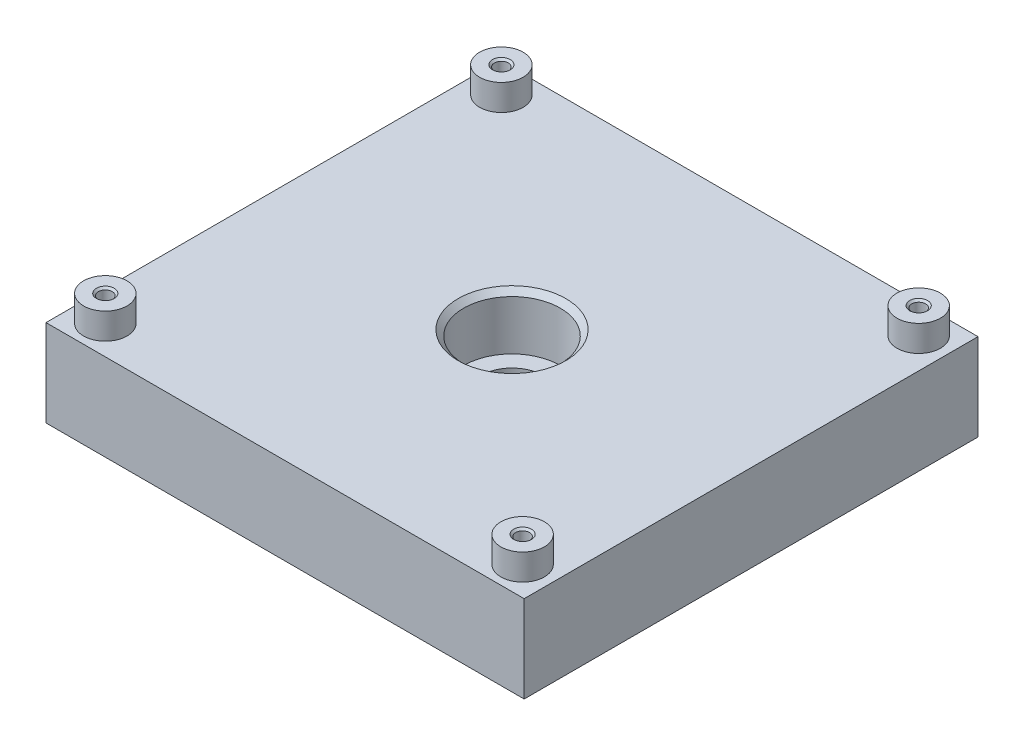
ISO-10303-21;
HEADER;
FILE_DESCRIPTION(('STEP AP214'),'2;1');
FILE_NAME('part.step','',(''),(''),'','','');
FILE_SCHEMA(('AUTOMOTIVE_DESIGN { 1 0 10303 214 1 1 1 1 }'));
ENDSEC;
DATA;
#1=APPLICATION_CONTEXT('core data for automotive mechanical design processes');
#2=APPLICATION_PROTOCOL_DEFINITION('international standard','automotive_design',2000,#1);
#3=PRODUCT_CONTEXT('',#1,'mechanical');
#4=PRODUCT('Part','Part','',(#3));
#5=PRODUCT_RELATED_PRODUCT_CATEGORY('part','',(#4));
#6=PRODUCT_DEFINITION_FORMATION('','',#4);
#7=PRODUCT_DEFINITION_CONTEXT('part definition',#1,'design');
#8=PRODUCT_DEFINITION('design','',#6,#7);
#9=PRODUCT_DEFINITION_SHAPE('','',#8);
#10=(LENGTH_UNIT() NAMED_UNIT(*) SI_UNIT(.MILLI.,.METRE.));
#11=(NAMED_UNIT(*) PLANE_ANGLE_UNIT() SI_UNIT($,.RADIAN.));
#12=(NAMED_UNIT(*) SI_UNIT($,.STERADIAN.) SOLID_ANGLE_UNIT());
#13=UNCERTAINTY_MEASURE_WITH_UNIT(LENGTH_MEASURE(1.E-05),#10,'distance_accuracy_value','');
#14=(GEOMETRIC_REPRESENTATION_CONTEXT(3) GLOBAL_UNCERTAINTY_ASSIGNED_CONTEXT((#13)) GLOBAL_UNIT_ASSIGNED_CONTEXT((#10,
#11,#12)) REPRESENTATION_CONTEXT('',''));
#15=CARTESIAN_POINT('',(0.,0.,0.));
#16=DIRECTION('',(0.,0.,1.));
#17=DIRECTION('',(1.,0.,0.));
#18=AXIS2_PLACEMENT_3D('',#15,#16,#17);
#19=CARTESIAN_POINT('',(27.5,10.,-26.1));
#20=DIRECTION('',(-1.,0.,0.));
#21=DIRECTION('',(0.,0.,1.));
#22=AXIS2_PLACEMENT_3D('',#19,#20,#21);
#23=PLANE('',#22);
#24=DIRECTION('',(0.,0.,-1.));
#25=VECTOR('',#24,1.);
#26=CARTESIAN_POINT('',(27.5,0.,-26.1));
#27=LINE('',#26,#25);
#28=CARTESIAN_POINT('',(27.5,0.,26.1));
#29=VERTEX_POINT('',#28);
#30=CARTESIAN_POINT('',(27.5,0.,-26.1));
#31=VERTEX_POINT('',#30);
#32=EDGE_CURVE('E111',#29,#31,#27,.T.);
#33=ORIENTED_EDGE('',*,*,#32,.T.);
#34=DIRECTION('',(0.,-1.,0.));
#35=VECTOR('',#34,1.);
#36=CARTESIAN_POINT('',(27.5,10.,-26.1));
#37=LINE('',#36,#35);
#38=CARTESIAN_POINT('',(27.5,10.,-26.1));
#39=VERTEX_POINT('',#38);
#40=EDGE_CURVE('E11',#39,#31,#37,.T.);
#41=ORIENTED_EDGE('',*,*,#40,.F.);
#42=DIRECTION('',(0.,0.,-1.));
#43=VECTOR('',#42,1.);
#44=CARTESIAN_POINT('',(27.5,10.,-26.1));
#45=LINE('',#44,#43);
#46=CARTESIAN_POINT('',(27.5,10.,26.1));
#47=VERTEX_POINT('',#46);
#48=EDGE_CURVE('E95',#47,#39,#45,.T.);
#49=ORIENTED_EDGE('',*,*,#48,.F.);
#50=DIRECTION('',(0.,-1.,0.));
#51=VECTOR('',#50,1.);
#52=CARTESIAN_POINT('',(27.5,10.,26.1));
#53=LINE('',#52,#51);
#54=EDGE_CURVE('E107',#47,#29,#53,.T.);
#55=ORIENTED_EDGE('',*,*,#54,.T.);
#56=EDGE_LOOP('',(#33,#41,#49,#55));
#57=FACE_BOUND('',#56,.T.);
#58=ADVANCED_FACE('F43',(#57),#23,.F.);
#59=CARTESIAN_POINT('',(-27.5,10.,-26.1));
#60=DIRECTION('',(0.,0.,1.));
#61=DIRECTION('',(1.,0.,0.));
#62=AXIS2_PLACEMENT_3D('',#59,#60,#61);
#63=PLANE('',#62);
#64=DIRECTION('',(-1.,0.,0.));
#65=VECTOR('',#64,1.);
#66=CARTESIAN_POINT('',(-27.5,0.,-26.1));
#67=LINE('',#66,#65);
#68=CARTESIAN_POINT('',(-27.5,0.,-26.1));
#69=VERTEX_POINT('',#68);
#70=EDGE_CURVE('E100',#31,#69,#67,.T.);
#71=ORIENTED_EDGE('',*,*,#70,.T.);
#72=DIRECTION('',(0.,-1.,0.));
#73=VECTOR('',#72,1.);
#74=CARTESIAN_POINT('',(-27.5,10.,-26.1));
#75=LINE('',#74,#73);
#76=CARTESIAN_POINT('',(-27.5,10.,-26.1));
#77=VERTEX_POINT('',#76);
#78=EDGE_CURVE('E52',#77,#69,#75,.T.);
#79=ORIENTED_EDGE('',*,*,#78,.F.);
#80=DIRECTION('',(-1.,0.,0.));
#81=VECTOR('',#80,1.);
#82=CARTESIAN_POINT('',(-27.5,10.,-26.1));
#83=LINE('',#82,#81);
#84=EDGE_CURVE('E90',#39,#77,#83,.T.);
#85=ORIENTED_EDGE('',*,*,#84,.F.);
#86=ORIENTED_EDGE('',*,*,#40,.T.);
#87=EDGE_LOOP('',(#71,#79,#85,#86));
#88=FACE_BOUND('',#87,.T.);
#89=ADVANCED_FACE('F99',(#88),#63,.F.);
#90=CARTESIAN_POINT('',(-27.5,10.,-26.1));
#91=DIRECTION('',(1.,0.,0.));
#92=DIRECTION('',(0.,0.,-1.));
#93=AXIS2_PLACEMENT_3D('',#90,#91,#92);
#94=PLANE('',#93);
#95=DIRECTION('',(0.,0.,1.));
#96=VECTOR('',#95,1.);
#97=CARTESIAN_POINT('',(-27.5,0.,-26.1));
#98=LINE('',#97,#96);
#99=CARTESIAN_POINT('',(-27.5,0.,26.1));
#100=VERTEX_POINT('',#99);
#101=EDGE_CURVE('E77',#69,#100,#98,.T.);
#102=ORIENTED_EDGE('',*,*,#101,.T.);
#103=DIRECTION('',(0.,-1.,0.));
#104=VECTOR('',#103,1.);
#105=CARTESIAN_POINT('',(-27.5,10.,26.1));
#106=LINE('',#105,#104);
#107=CARTESIAN_POINT('',(-27.5,10.,26.1));
#108=VERTEX_POINT('',#107);
#109=EDGE_CURVE('E102',#108,#100,#106,.T.);
#110=ORIENTED_EDGE('',*,*,#109,.F.);
#111=DIRECTION('',(0.,0.,1.));
#112=VECTOR('',#111,1.);
#113=CARTESIAN_POINT('',(-27.5,10.,-26.1));
#114=LINE('',#113,#112);
#115=EDGE_CURVE('E93',#77,#108,#114,.T.);
#116=ORIENTED_EDGE('',*,*,#115,.F.);
#117=ORIENTED_EDGE('',*,*,#78,.T.);
#118=EDGE_LOOP('',(#102,#110,#116,#117));
#119=FACE_BOUND('',#118,.T.);
#120=ADVANCED_FACE('F103',(#119),#94,.F.);
#121=CARTESIAN_POINT('',(-27.5,10.,26.1));
#122=DIRECTION('',(0.,0.,-1.));
#123=DIRECTION('',(-1.,0.,0.));
#124=AXIS2_PLACEMENT_3D('',#121,#122,#123);
#125=PLANE('',#124);
#126=DIRECTION('',(1.,0.,0.));
#127=VECTOR('',#126,1.);
#128=CARTESIAN_POINT('',(-27.5,0.,26.1));
#129=LINE('',#128,#127);
#130=EDGE_CURVE('E83',#100,#29,#129,.T.);
#131=ORIENTED_EDGE('',*,*,#130,.T.);
#132=ORIENTED_EDGE('',*,*,#54,.F.);
#133=DIRECTION('',(1.,0.,0.));
#134=VECTOR('',#133,1.);
#135=CARTESIAN_POINT('',(-27.5,10.,26.1));
#136=LINE('',#135,#134);
#137=EDGE_CURVE('E60',#108,#47,#136,.T.);
#138=ORIENTED_EDGE('',*,*,#137,.F.);
#139=ORIENTED_EDGE('',*,*,#109,.T.);
#140=EDGE_LOOP('',(#131,#132,#138,#139));
#141=FACE_BOUND('',#140,.T.);
#142=ADVANCED_FACE('F125',(#141),#125,.F.);
#143=CARTESIAN_POINT('',(0.,10.,0.));
#144=DIRECTION('',(0.,1.,0.));
#145=DIRECTION('',(0.,0.,1.));
#146=AXIS2_PLACEMENT_3D('',#143,#144,#145);
#147=PLANE('',#146);
#148=CARTESIAN_POINT('',(24.,10.,22.7781818181818));
#149=DIRECTION('',(0.,1.,0.));
#150=DIRECTION('',(0.,0.,1.));
#151=AXIS2_PLACEMENT_3D('',#148,#149,#150);
#152=CIRCLE('',#151,2.5);
#153=CARTESIAN_POINT('',(24.,10.,25.2781818181818));
#154=VERTEX_POINT('',#153);
#155=EDGE_CURVE('E176',#154,#154,#152,.T.);
#156=ORIENTED_EDGE('',*,*,#155,.F.);
#157=EDGE_LOOP('',(#156));
#158=FACE_BOUND('',#157,.T.);
#159=CARTESIAN_POINT('',(-24.,10.,22.7781818181818));
#160=DIRECTION('',(0.,1.,0.));
#161=DIRECTION('',(0.,0.,1.));
#162=AXIS2_PLACEMENT_3D('',#159,#160,#161);
#163=CIRCLE('',#162,2.5);
#164=CARTESIAN_POINT('',(-24.,10.,25.2781818181818));
#165=VERTEX_POINT('',#164);
#166=EDGE_CURVE('E168',#165,#165,#163,.T.);
#167=ORIENTED_EDGE('',*,*,#166,.F.);
#168=EDGE_LOOP('',(#167));
#169=FACE_BOUND('',#168,.T.);
#170=CARTESIAN_POINT('',(24.,10.,-22.7781818181818));
#171=DIRECTION('',(0.,1.,0.));
#172=DIRECTION('',(0.,0.,1.));
#173=AXIS2_PLACEMENT_3D('',#170,#171,#172);
#174=CIRCLE('',#173,2.5);
#175=CARTESIAN_POINT('',(24.,10.,-20.2781818181818));
#176=VERTEX_POINT('',#175);
#177=EDGE_CURVE('E160',#176,#176,#174,.T.);
#178=ORIENTED_EDGE('',*,*,#177,.F.);
#179=EDGE_LOOP('',(#178));
#180=FACE_BOUND('',#179,.T.);
#181=CARTESIAN_POINT('',(-24.,10.,-22.7781818181818));
#182=DIRECTION('',(0.,1.,0.));
#183=DIRECTION('',(0.,0.,1.));
#184=AXIS2_PLACEMENT_3D('',#181,#182,#183);
#185=CIRCLE('',#184,2.5);
#186=CARTESIAN_POINT('',(-24.,10.,-20.2781818181818));
#187=VERTEX_POINT('',#186);
#188=EDGE_CURVE('E152',#187,#187,#185,.T.);
#189=ORIENTED_EDGE('',*,*,#188,.F.);
#190=EDGE_LOOP('',(#189));
#191=FACE_BOUND('',#190,.T.);
#192=CARTESIAN_POINT('',(0.,10.,0.));
#193=DIRECTION('',(0.,1.,0.));
#194=DIRECTION('',(0.,0.,1.));
#195=AXIS2_PLACEMENT_3D('',#192,#193,#194);
#196=CIRCLE('',#195,6.19125);
#197=CARTESIAN_POINT('',(0.,10.,6.19125));
#198=VERTEX_POINT('',#197);
#199=EDGE_CURVE('E147',#198,#198,#196,.T.);
#200=ORIENTED_EDGE('',*,*,#199,.F.);
#201=EDGE_LOOP('',(#200));
#202=FACE_BOUND('',#201,.T.);
#203=ORIENTED_EDGE('',*,*,#48,.T.);
#204=ORIENTED_EDGE('',*,*,#84,.T.);
#205=ORIENTED_EDGE('',*,*,#115,.T.);
#206=ORIENTED_EDGE('',*,*,#137,.T.);
#207=EDGE_LOOP('',(#203,#204,#205,#206));
#208=FACE_BOUND('',#207,.T.);
#209=ADVANCED_FACE('F91',(#158,#169,#180,#191,#202,#208),#147,.T.);
#210=CARTESIAN_POINT('',(0.,0.,0.));
#211=DIRECTION('',(0.,1.,0.));
#212=DIRECTION('',(0.,0.,1.));
#213=AXIS2_PLACEMENT_3D('',#210,#211,#212);
#214=PLANE('',#213);
#215=CARTESIAN_POINT('',(-24.,0.,-22.7781818181818));
#216=DIRECTION('',(0.,1.,0.));
#217=DIRECTION('',(0.,0.,1.));
#218=AXIS2_PLACEMENT_3D('',#215,#216,#217);
#219=CIRCLE('',#218,0.799999999999999);
#220=CARTESIAN_POINT('',(-24.,0.,-21.9781818181818));
#221=VERTEX_POINT('',#220);
#222=EDGE_CURVE('E219',#221,#221,#219,.T.);
#223=ORIENTED_EDGE('',*,*,#222,.T.);
#224=EDGE_LOOP('',(#223));
#225=FACE_BOUND('',#224,.T.);
#226=CARTESIAN_POINT('',(24.,0.,-22.7781818181818));
#227=DIRECTION('',(0.,1.,0.));
#228=DIRECTION('',(0.,0.,1.));
#229=AXIS2_PLACEMENT_3D('',#226,#227,#228);
#230=CIRCLE('',#229,0.799999999999999);
#231=CARTESIAN_POINT('',(24.,0.,-21.9781818181818));
#232=VERTEX_POINT('',#231);
#233=EDGE_CURVE('E207',#232,#232,#230,.T.);
#234=ORIENTED_EDGE('',*,*,#233,.T.);
#235=EDGE_LOOP('',(#234));
#236=FACE_BOUND('',#235,.T.);
#237=CARTESIAN_POINT('',(-24.,0.,22.7781818181818));
#238=DIRECTION('',(0.,1.,0.));
#239=DIRECTION('',(0.,0.,1.));
#240=AXIS2_PLACEMENT_3D('',#237,#238,#239);
#241=CIRCLE('',#240,0.799999999999999);
#242=CARTESIAN_POINT('',(-24.,0.,23.5781818181818));
#243=VERTEX_POINT('',#242);
#244=EDGE_CURVE('E195',#243,#243,#241,.T.);
#245=ORIENTED_EDGE('',*,*,#244,.T.);
#246=EDGE_LOOP('',(#245));
#247=FACE_BOUND('',#246,.T.);
#248=CARTESIAN_POINT('',(24.,0.,22.7781818181818));
#249=DIRECTION('',(0.,1.,0.));
#250=DIRECTION('',(0.,0.,1.));
#251=AXIS2_PLACEMENT_3D('',#248,#249,#250);
#252=CIRCLE('',#251,0.799999999999999);
#253=CARTESIAN_POINT('',(24.,0.,23.5781818181818));
#254=VERTEX_POINT('',#253);
#255=EDGE_CURVE('E180',#254,#254,#252,.T.);
#256=ORIENTED_EDGE('',*,*,#255,.T.);
#257=EDGE_LOOP('',(#256));
#258=FACE_BOUND('',#257,.T.);
#259=CARTESIAN_POINT('',(0.,0.,0.));
#260=DIRECTION('',(0.,1.,0.));
#261=DIRECTION('',(0.,0.,1.));
#262=AXIS2_PLACEMENT_3D('',#259,#260,#261);
#263=CIRCLE('',#262,3.57124);
#264=CARTESIAN_POINT('',(0.,0.,3.57124));
#265=VERTEX_POINT('',#264);
#266=EDGE_CURVE('E115',#265,#265,#263,.T.);
#267=ORIENTED_EDGE('',*,*,#266,.T.);
#268=EDGE_LOOP('',(#267));
#269=FACE_BOUND('',#268,.T.);
#270=ORIENTED_EDGE('',*,*,#32,.F.);
#271=ORIENTED_EDGE('',*,*,#130,.F.);
#272=ORIENTED_EDGE('',*,*,#101,.F.);
#273=ORIENTED_EDGE('',*,*,#70,.F.);
#274=EDGE_LOOP('',(#270,#271,#272,#273));
#275=FACE_BOUND('',#274,.T.);
#276=ADVANCED_FACE('F128',(#225,#236,#247,#258,#269,#275),#214,.F.);
#277=CARTESIAN_POINT('',(0.,10.,0.));
#278=DIRECTION('',(0.,1.,0.));
#279=DIRECTION('',(0.,0.,1.));
#280=AXIS2_PLACEMENT_3D('',#277,#278,#279);
#281=CYLINDRICAL_SURFACE('',#280,3.57124);
#282=ORIENTED_EDGE('',*,*,#266,.F.);
#283=EDGE_LOOP('',(#282));
#284=FACE_BOUND('',#283,.T.);
#285=CARTESIAN_POINT('',(0.,3.65,0.));
#286=DIRECTION('',(0.,1.,0.));
#287=DIRECTION('',(0.,0.,1.));
#288=AXIS2_PLACEMENT_3D('',#285,#286,#287);
#289=CIRCLE('',#288,3.57124);
#290=CARTESIAN_POINT('',(0.,3.65,3.57124));
#291=VERTEX_POINT('',#290);
#292=EDGE_CURVE('E135',#291,#291,#289,.T.);
#293=ORIENTED_EDGE('',*,*,#292,.T.);
#294=EDGE_LOOP('',(#293));
#295=FACE_BOUND('',#294,.T.);
#296=ADVANCED_FACE('F277',(#284,#295),#281,.F.);
#297=CARTESIAN_POINT('',(5.55625,3.65,0.));
#298=DIRECTION('',(0.,-1.,0.));
#299=DIRECTION('',(0.,0.,-1.));
#300=AXIS2_PLACEMENT_3D('',#297,#298,#299);
#301=PLANE('',#300);
#302=ORIENTED_EDGE('',*,*,#292,.F.);
#303=EDGE_LOOP('',(#302));
#304=FACE_BOUND('',#303,.T.);
#305=CARTESIAN_POINT('',(0.,3.65,0.));
#306=DIRECTION('',(0.,1.,0.));
#307=DIRECTION('',(0.,0.,1.));
#308=AXIS2_PLACEMENT_3D('',#305,#306,#307);
#309=CIRCLE('',#308,5.55625);
#310=CARTESIAN_POINT('',(0.,3.65,5.55625));
#311=VERTEX_POINT('',#310);
#312=EDGE_CURVE('E139',#311,#311,#309,.T.);
#313=ORIENTED_EDGE('',*,*,#312,.T.);
#314=EDGE_LOOP('',(#313));
#315=FACE_BOUND('',#314,.T.);
#316=ADVANCED_FACE('F261',(#304,#315),#301,.F.);
#317=CARTESIAN_POINT('',(0.,10.,0.));
#318=DIRECTION('',(0.,1.,0.));
#319=DIRECTION('',(0.,0.,1.));
#320=AXIS2_PLACEMENT_3D('',#317,#318,#319);
#321=CYLINDRICAL_SURFACE('',#320,5.55625);
#322=ORIENTED_EDGE('',*,*,#312,.F.);
#323=EDGE_LOOP('',(#322));
#324=FACE_BOUND('',#323,.T.);
#325=CARTESIAN_POINT('',(0.,9.365,0.));
#326=DIRECTION('',(0.,1.,0.));
#327=DIRECTION('',(0.,0.,1.));
#328=AXIS2_PLACEMENT_3D('',#325,#326,#327);
#329=CIRCLE('',#328,5.55625);
#330=CARTESIAN_POINT('',(0.,9.365,5.55625));
#331=VERTEX_POINT('',#330);
#332=EDGE_CURVE('E143',#331,#331,#329,.T.);
#333=ORIENTED_EDGE('',*,*,#332,.T.);
#334=EDGE_LOOP('',(#333));
#335=FACE_BOUND('',#334,.T.);
#336=ADVANCED_FACE('F255',(#324,#335),#321,.F.);
#337=CARTESIAN_POINT('',(0.,10.,0.));
#338=DIRECTION('',(0.,1.,0.));
#339=DIRECTION('',(0.,0.,1.));
#340=AXIS2_PLACEMENT_3D('',#337,#338,#339);
#341=CONICAL_SURFACE('',#340,6.19125,0.78539816339745);
#342=ORIENTED_EDGE('',*,*,#332,.F.);
#343=EDGE_LOOP('',(#342));
#344=FACE_BOUND('',#343,.T.);
#345=ORIENTED_EDGE('',*,*,#199,.T.);
#346=EDGE_LOOP('',(#345));
#347=FACE_BOUND('',#346,.T.);
#348=ADVANCED_FACE('F244',(#344,#347),#341,.F.);
#349=CARTESIAN_POINT('',(-24.,13.,-22.7781818181818));
#350=DIRECTION('',(0.,-1.,0.));
#351=DIRECTION('',(0.,0.,-1.));
#352=AXIS2_PLACEMENT_3D('',#349,#350,#351);
#353=CYLINDRICAL_SURFACE('',#352,2.5);
#354=CARTESIAN_POINT('',(-24.,13.,-22.7781818181818));
#355=DIRECTION('',(0.,1.,0.));
#356=DIRECTION('',(0.,0.,1.));
#357=AXIS2_PLACEMENT_3D('',#354,#355,#356);
#358=CIRCLE('',#357,2.5);
#359=CARTESIAN_POINT('',(-24.,13.,-20.2781818181818));
#360=VERTEX_POINT('',#359);
#361=EDGE_CURVE('E151',#360,#360,#358,.T.);
#362=ORIENTED_EDGE('',*,*,#361,.F.);
#363=EDGE_LOOP('',(#362));
#364=FACE_BOUND('',#363,.T.);
#365=ORIENTED_EDGE('',*,*,#188,.T.);
#366=EDGE_LOOP('',(#365));
#367=FACE_BOUND('',#366,.T.);
#368=ADVANCED_FACE('F238',(#364,#367),#353,.T.);
#369=CARTESIAN_POINT('',(-24.,13.,-22.7781818181818));
#370=DIRECTION('',(0.,1.,0.));
#371=DIRECTION('',(0.,0.,1.));
#372=AXIS2_PLACEMENT_3D('',#369,#370,#371);
#373=PLANE('',#372);
#374=CARTESIAN_POINT('',(-24.,13.,-22.7781818181818));
#375=DIRECTION('',(0.,1.,0.));
#376=DIRECTION('',(0.,0.,1.));
#377=AXIS2_PLACEMENT_3D('',#374,#375,#376);
#378=CIRCLE('',#377,1.025);
#379=CARTESIAN_POINT('',(-24.,13.,-21.7531818181818));
#380=VERTEX_POINT('',#379);
#381=EDGE_CURVE('E227',#380,#380,#378,.T.);
#382=ORIENTED_EDGE('',*,*,#381,.F.);
#383=EDGE_LOOP('',(#382));
#384=FACE_BOUND('',#383,.T.);
#385=ORIENTED_EDGE('',*,*,#361,.T.);
#386=EDGE_LOOP('',(#385));
#387=FACE_BOUND('',#386,.T.);
#388=ADVANCED_FACE('F234',(#384,#387),#373,.T.);
#389=CARTESIAN_POINT('',(24.,13.,-22.7781818181818));
#390=DIRECTION('',(0.,-1.,0.));
#391=DIRECTION('',(0.,0.,-1.));
#392=AXIS2_PLACEMENT_3D('',#389,#390,#391);
#393=CYLINDRICAL_SURFACE('',#392,2.5);
#394=CARTESIAN_POINT('',(24.,13.,-22.7781818181818));
#395=DIRECTION('',(0.,1.,0.));
#396=DIRECTION('',(0.,0.,1.));
#397=AXIS2_PLACEMENT_3D('',#394,#395,#396);
#398=CIRCLE('',#397,2.5);
#399=CARTESIAN_POINT('',(24.,13.,-20.2781818181818));
#400=VERTEX_POINT('',#399);
#401=EDGE_CURVE('E156',#400,#400,#398,.T.);
#402=ORIENTED_EDGE('',*,*,#401,.F.);
#403=EDGE_LOOP('',(#402));
#404=FACE_BOUND('',#403,.T.);
#405=ORIENTED_EDGE('',*,*,#177,.T.);
#406=EDGE_LOOP('',(#405));
#407=FACE_BOUND('',#406,.T.);
#408=ADVANCED_FACE('F237',(#404,#407),#393,.T.);
#409=CARTESIAN_POINT('',(24.,13.,-22.7781818181818));
#410=DIRECTION('',(0.,1.,0.));
#411=DIRECTION('',(0.,0.,1.));
#412=AXIS2_PLACEMENT_3D('',#409,#410,#411);
#413=PLANE('',#412);
#414=CARTESIAN_POINT('',(24.,13.,-22.7781818181818));
#415=DIRECTION('',(0.,1.,0.));
#416=DIRECTION('',(0.,0.,1.));
#417=AXIS2_PLACEMENT_3D('',#414,#415,#416);
#418=CIRCLE('',#417,1.025);
#419=CARTESIAN_POINT('',(24.,13.,-21.7531818181818));
#420=VERTEX_POINT('',#419);
#421=EDGE_CURVE('E215',#420,#420,#418,.T.);
#422=ORIENTED_EDGE('',*,*,#421,.F.);
#423=EDGE_LOOP('',(#422));
#424=FACE_BOUND('',#423,.T.);
#425=ORIENTED_EDGE('',*,*,#401,.T.);
#426=EDGE_LOOP('',(#425));
#427=FACE_BOUND('',#426,.T.);
#428=ADVANCED_FACE('F326',(#424,#427),#413,.T.);
#429=CARTESIAN_POINT('',(-24.,13.,22.7781818181818));
#430=DIRECTION('',(0.,-1.,0.));
#431=DIRECTION('',(0.,0.,-1.));
#432=AXIS2_PLACEMENT_3D('',#429,#430,#431);
#433=CYLINDRICAL_SURFACE('',#432,2.5);
#434=CARTESIAN_POINT('',(-24.,13.,22.7781818181818));
#435=DIRECTION('',(0.,1.,0.));
#436=DIRECTION('',(0.,0.,1.));
#437=AXIS2_PLACEMENT_3D('',#434,#435,#436);
#438=CIRCLE('',#437,2.5);
#439=CARTESIAN_POINT('',(-24.,13.,25.2781818181818));
#440=VERTEX_POINT('',#439);
#441=EDGE_CURVE('E164',#440,#440,#438,.T.);
#442=ORIENTED_EDGE('',*,*,#441,.F.);
#443=EDGE_LOOP('',(#442));
#444=FACE_BOUND('',#443,.T.);
#445=ORIENTED_EDGE('',*,*,#166,.T.);
#446=EDGE_LOOP('',(#445));
#447=FACE_BOUND('',#446,.T.);
#448=ADVANCED_FACE('F334',(#444,#447),#433,.T.);
#449=CARTESIAN_POINT('',(-24.,13.,22.7781818181818));
#450=DIRECTION('',(0.,1.,0.));
#451=DIRECTION('',(0.,0.,1.));
#452=AXIS2_PLACEMENT_3D('',#449,#450,#451);
#453=PLANE('',#452);
#454=CARTESIAN_POINT('',(-24.,13.,22.7781818181818));
#455=DIRECTION('',(0.,1.,0.));
#456=DIRECTION('',(0.,0.,1.));
#457=AXIS2_PLACEMENT_3D('',#454,#455,#456);
#458=CIRCLE('',#457,1.025);
#459=CARTESIAN_POINT('',(-24.,13.,23.8031818181818));
#460=VERTEX_POINT('',#459);
#461=EDGE_CURVE('E203',#460,#460,#458,.T.);
#462=ORIENTED_EDGE('',*,*,#461,.F.);
#463=EDGE_LOOP('',(#462));
#464=FACE_BOUND('',#463,.T.);
#465=ORIENTED_EDGE('',*,*,#441,.T.);
#466=EDGE_LOOP('',(#465));
#467=FACE_BOUND('',#466,.T.);
#468=ADVANCED_FACE('F339',(#464,#467),#453,.T.);
#469=CARTESIAN_POINT('',(24.,13.,22.7781818181818));
#470=DIRECTION('',(0.,-1.,0.));
#471=DIRECTION('',(0.,0.,-1.));
#472=AXIS2_PLACEMENT_3D('',#469,#470,#471);
#473=CYLINDRICAL_SURFACE('',#472,2.5);
#474=CARTESIAN_POINT('',(24.,13.,22.7781818181818));
#475=DIRECTION('',(0.,1.,0.));
#476=DIRECTION('',(0.,0.,1.));
#477=AXIS2_PLACEMENT_3D('',#474,#475,#476);
#478=CIRCLE('',#477,2.5);
#479=CARTESIAN_POINT('',(24.,13.,25.2781818181818));
#480=VERTEX_POINT('',#479);
#481=EDGE_CURVE('E172',#480,#480,#478,.T.);
#482=ORIENTED_EDGE('',*,*,#481,.F.);
#483=EDGE_LOOP('',(#482));
#484=FACE_BOUND('',#483,.T.);
#485=ORIENTED_EDGE('',*,*,#155,.T.);
#486=EDGE_LOOP('',(#485));
#487=FACE_BOUND('',#486,.T.);
#488=ADVANCED_FACE('F347',(#484,#487),#473,.T.);
#489=CARTESIAN_POINT('',(24.,13.,22.7781818181818));
#490=DIRECTION('',(0.,1.,0.));
#491=DIRECTION('',(0.,0.,1.));
#492=AXIS2_PLACEMENT_3D('',#489,#490,#491);
#493=PLANE('',#492);
#494=CARTESIAN_POINT('',(24.,13.,22.7781818181818));
#495=DIRECTION('',(0.,1.,0.));
#496=DIRECTION('',(0.,0.,1.));
#497=AXIS2_PLACEMENT_3D('',#494,#495,#496);
#498=CIRCLE('',#497,1.025);
#499=CARTESIAN_POINT('',(24.,13.,23.8031818181818));
#500=VERTEX_POINT('',#499);
#501=EDGE_CURVE('E191',#500,#500,#498,.T.);
#502=ORIENTED_EDGE('',*,*,#501,.F.);
#503=EDGE_LOOP('',(#502));
#504=FACE_BOUND('',#503,.T.);
#505=ORIENTED_EDGE('',*,*,#481,.T.);
#506=EDGE_LOOP('',(#505));
#507=FACE_BOUND('',#506,.T.);
#508=ADVANCED_FACE('F352',(#504,#507),#493,.T.);
#509=CARTESIAN_POINT('',(24.,13.,22.7781818181818));
#510=DIRECTION('',(0.,1.,0.));
#511=DIRECTION('',(0.,0.,1.));
#512=AXIS2_PLACEMENT_3D('',#509,#510,#511);
#513=CYLINDRICAL_SURFACE('',#512,0.799999999999999);
#514=ORIENTED_EDGE('',*,*,#255,.F.);
#515=EDGE_LOOP('',(#514));
#516=FACE_BOUND('',#515,.T.);
#517=CARTESIAN_POINT('',(24.,12.775,22.7781818181818));
#518=DIRECTION('',(0.,1.,0.));
#519=DIRECTION('',(0.,0.,1.));
#520=AXIS2_PLACEMENT_3D('',#517,#518,#519);
#521=CIRCLE('',#520,0.799999999999999);
#522=CARTESIAN_POINT('',(24.,12.775,23.5781818181818));
#523=VERTEX_POINT('',#522);
#524=EDGE_CURVE('E187',#523,#523,#521,.T.);
#525=ORIENTED_EDGE('',*,*,#524,.T.);
#526=EDGE_LOOP('',(#525));
#527=FACE_BOUND('',#526,.T.);
#528=ADVANCED_FACE('F387',(#516,#527),#513,.F.);
#529=CARTESIAN_POINT('',(24.,13.,22.7781818181818));
#530=DIRECTION('',(0.,1.,0.));
#531=DIRECTION('',(0.,0.,1.));
#532=AXIS2_PLACEMENT_3D('',#529,#530,#531);
#533=CONICAL_SURFACE('',#532,1.025,0.785398163397452);
#534=ORIENTED_EDGE('',*,*,#524,.F.);
#535=EDGE_LOOP('',(#534));
#536=FACE_BOUND('',#535,.T.);
#537=ORIENTED_EDGE('',*,*,#501,.T.);
#538=EDGE_LOOP('',(#537));
#539=FACE_BOUND('',#538,.T.);
#540=ADVANCED_FACE('F398',(#536,#539),#533,.F.);
#541=CARTESIAN_POINT('',(-24.,13.,22.7781818181818));
#542=DIRECTION('',(0.,1.,0.));
#543=DIRECTION('',(0.,0.,1.));
#544=AXIS2_PLACEMENT_3D('',#541,#542,#543);
#545=CYLINDRICAL_SURFACE('',#544,0.799999999999999);
#546=ORIENTED_EDGE('',*,*,#244,.F.);
#547=EDGE_LOOP('',(#546));
#548=FACE_BOUND('',#547,.T.);
#549=CARTESIAN_POINT('',(-24.,12.775,22.7781818181818));
#550=DIRECTION('',(0.,1.,0.));
#551=DIRECTION('',(0.,0.,1.));
#552=AXIS2_PLACEMENT_3D('',#549,#550,#551);
#553=CIRCLE('',#552,0.799999999999999);
#554=CARTESIAN_POINT('',(-24.,12.775,23.5781818181818));
#555=VERTEX_POINT('',#554);
#556=EDGE_CURVE('E199',#555,#555,#553,.T.);
#557=ORIENTED_EDGE('',*,*,#556,.T.);
#558=EDGE_LOOP('',(#557));
#559=FACE_BOUND('',#558,.T.);
#560=ADVANCED_FACE('F411',(#548,#559),#545,.F.);
#561=CARTESIAN_POINT('',(-24.,13.,22.7781818181818));
#562=DIRECTION('',(0.,1.,0.));
#563=DIRECTION('',(0.,0.,1.));
#564=AXIS2_PLACEMENT_3D('',#561,#562,#563);
#565=CONICAL_SURFACE('',#564,1.025,0.785398163397452);
#566=ORIENTED_EDGE('',*,*,#556,.F.);
#567=EDGE_LOOP('',(#566));
#568=FACE_BOUND('',#567,.T.);
#569=ORIENTED_EDGE('',*,*,#461,.T.);
#570=EDGE_LOOP('',(#569));
#571=FACE_BOUND('',#570,.T.);
#572=ADVANCED_FACE('F422',(#568,#571),#565,.F.);
#573=CARTESIAN_POINT('',(24.,13.,-22.7781818181818));
#574=DIRECTION('',(0.,1.,0.));
#575=DIRECTION('',(0.,0.,1.));
#576=AXIS2_PLACEMENT_3D('',#573,#574,#575);
#577=CYLINDRICAL_SURFACE('',#576,0.799999999999999);
#578=ORIENTED_EDGE('',*,*,#233,.F.);
#579=EDGE_LOOP('',(#578));
#580=FACE_BOUND('',#579,.T.);
#581=CARTESIAN_POINT('',(24.,12.775,-22.7781818181818));
#582=DIRECTION('',(0.,1.,0.));
#583=DIRECTION('',(0.,0.,1.));
#584=AXIS2_PLACEMENT_3D('',#581,#582,#583);
#585=CIRCLE('',#584,0.799999999999999);
#586=CARTESIAN_POINT('',(24.,12.775,-21.9781818181818));
#587=VERTEX_POINT('',#586);
#588=EDGE_CURVE('E211',#587,#587,#585,.T.);
#589=ORIENTED_EDGE('',*,*,#588,.T.);
#590=EDGE_LOOP('',(#589));
#591=FACE_BOUND('',#590,.T.);
#592=ADVANCED_FACE('F434',(#580,#591),#577,.F.);
#593=CARTESIAN_POINT('',(24.,13.,-22.7781818181818));
#594=DIRECTION('',(0.,1.,0.));
#595=DIRECTION('',(0.,0.,1.));
#596=AXIS2_PLACEMENT_3D('',#593,#594,#595);
#597=CONICAL_SURFACE('',#596,1.025,0.785398163397452);
#598=ORIENTED_EDGE('',*,*,#588,.F.);
#599=EDGE_LOOP('',(#598));
#600=FACE_BOUND('',#599,.T.);
#601=ORIENTED_EDGE('',*,*,#421,.T.);
#602=EDGE_LOOP('',(#601));
#603=FACE_BOUND('',#602,.T.);
#604=ADVANCED_FACE('F445',(#600,#603),#597,.F.);
#605=CARTESIAN_POINT('',(-24.,13.,-22.7781818181818));
#606=DIRECTION('',(0.,1.,0.));
#607=DIRECTION('',(0.,0.,1.));
#608=AXIS2_PLACEMENT_3D('',#605,#606,#607);
#609=CYLINDRICAL_SURFACE('',#608,0.799999999999999);
#610=ORIENTED_EDGE('',*,*,#222,.F.);
#611=EDGE_LOOP('',(#610));
#612=FACE_BOUND('',#611,.T.);
#613=CARTESIAN_POINT('',(-24.,12.775,-22.7781818181818));
#614=DIRECTION('',(0.,1.,0.));
#615=DIRECTION('',(0.,0.,1.));
#616=AXIS2_PLACEMENT_3D('',#613,#614,#615);
#617=CIRCLE('',#616,0.799999999999999);
#618=CARTESIAN_POINT('',(-24.,12.775,-21.9781818181818));
#619=VERTEX_POINT('',#618);
#620=EDGE_CURVE('E223',#619,#619,#617,.T.);
#621=ORIENTED_EDGE('',*,*,#620,.T.);
#622=EDGE_LOOP('',(#621));
#623=FACE_BOUND('',#622,.T.);
#624=ADVANCED_FACE('F457',(#612,#623),#609,.F.);
#625=CARTESIAN_POINT('',(-24.,13.,-22.7781818181818));
#626=DIRECTION('',(0.,1.,0.));
#627=DIRECTION('',(0.,0.,1.));
#628=AXIS2_PLACEMENT_3D('',#625,#626,#627);
#629=CONICAL_SURFACE('',#628,1.025,0.785398163397452);
#630=ORIENTED_EDGE('',*,*,#620,.F.);
#631=EDGE_LOOP('',(#630));
#632=FACE_BOUND('',#631,.T.);
#633=ORIENTED_EDGE('',*,*,#381,.T.);
#634=EDGE_LOOP('',(#633));
#635=FACE_BOUND('',#634,.T.);
#636=ADVANCED_FACE('F232',(#632,#635),#629,.F.);
#637=CLOSED_SHELL('',(#58,#89,#120,#142,#209,#276,#296,#316,#336,#348,#368,#388,#408,#428,#448,
#468,#488,#508,#528,#540,#560,#572,#592,#604,#624,#636));
#638=MANIFOLD_SOLID_BREP('B2',#637);
#639=ADVANCED_BREP_SHAPE_REPRESENTATION('',(#18,#638),#14);
#640=SHAPE_DEFINITION_REPRESENTATION(#9,#639);
ENDSEC;
END-ISO-10303-21;
